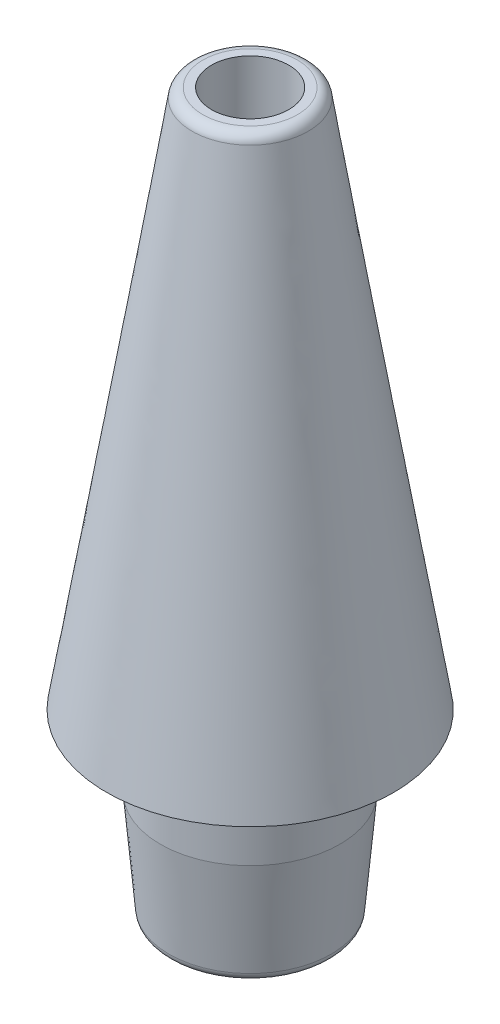
ISO-10303-21;
HEADER;
FILE_DESCRIPTION(('STEP AP214'),'2;1');
FILE_NAME('part.step','',(''),(''),'','','');
FILE_SCHEMA(('AUTOMOTIVE_DESIGN { 1 0 10303 214 1 1 1 1 }'));
ENDSEC;
DATA;
#1=APPLICATION_CONTEXT('core data for automotive mechanical design processes');
#2=APPLICATION_PROTOCOL_DEFINITION('international standard','automotive_design',2000,#1);
#3=PRODUCT_CONTEXT('',#1,'mechanical');
#4=PRODUCT('Part','Part','',(#3));
#5=PRODUCT_RELATED_PRODUCT_CATEGORY('part','',(#4));
#6=PRODUCT_DEFINITION_FORMATION('','',#4);
#7=PRODUCT_DEFINITION_CONTEXT('part definition',#1,'design');
#8=PRODUCT_DEFINITION('design','',#6,#7);
#9=PRODUCT_DEFINITION_SHAPE('','',#8);
#10=(LENGTH_UNIT() NAMED_UNIT(*) SI_UNIT(.MILLI.,.METRE.));
#11=(NAMED_UNIT(*) PLANE_ANGLE_UNIT() SI_UNIT($,.RADIAN.));
#12=(NAMED_UNIT(*) SI_UNIT($,.STERADIAN.) SOLID_ANGLE_UNIT());
#13=UNCERTAINTY_MEASURE_WITH_UNIT(LENGTH_MEASURE(1.E-05),#10,'distance_accuracy_value','');
#14=(GEOMETRIC_REPRESENTATION_CONTEXT(3) GLOBAL_UNCERTAINTY_ASSIGNED_CONTEXT((#13)) GLOBAL_UNIT_ASSIGNED_CONTEXT((#10,
#11,#12)) REPRESENTATION_CONTEXT('',''));
#15=CARTESIAN_POINT('',(0.,0.,0.));
#16=DIRECTION('',(0.,0.,1.));
#17=DIRECTION('',(1.,0.,0.));
#18=AXIS2_PLACEMENT_3D('',#15,#16,#17);
#19=CARTESIAN_POINT('',(0.,5.,0.));
#20=DIRECTION('',(0.,-1.,0.));
#21=DIRECTION('',(0.,0.,-1.));
#22=AXIS2_PLACEMENT_3D('',#19,#20,#21);
#23=CYLINDRICAL_SURFACE('',#22,2.5);
#24=CARTESIAN_POINT('',(0.,4.75,0.));
#25=DIRECTION('',(0.,1.,0.));
#26=DIRECTION('',(0.,0.,1.));
#27=AXIS2_PLACEMENT_3D('',#24,#25,#26);
#28=CIRCLE('',#27,2.5);
#29=CARTESIAN_POINT('',(0.,4.75,2.5));
#30=VERTEX_POINT('',#29);
#31=EDGE_CURVE('E61',#30,#30,#28,.F.);
#32=ORIENTED_EDGE('',*,*,#31,.T.);
#33=EDGE_LOOP('',(#32));
#34=FACE_BOUND('',#33,.T.);
#35=CARTESIAN_POINT('',(0.,2.99999999999999,0.));
#36=DIRECTION('',(0.,1.,0.));
#37=DIRECTION('',(0.,0.,1.));
#38=AXIS2_PLACEMENT_3D('',#35,#36,#37);
#39=CIRCLE('',#38,2.5);
#40=CARTESIAN_POINT('',(0.,2.99999999999999,2.5));
#41=VERTEX_POINT('',#40);
#42=EDGE_CURVE('E73',#41,#41,#39,.T.);
#43=ORIENTED_EDGE('',*,*,#42,.T.);
#44=EDGE_LOOP('',(#43));
#45=FACE_BOUND('',#44,.T.);
#46=ADVANCED_FACE('F39',(#34,#45),#23,.T.);
#47=CARTESIAN_POINT('',(0.,0.,0.));
#48=DIRECTION('',(0.,1.,0.));
#49=DIRECTION('',(0.,0.,1.));
#50=AXIS2_PLACEMENT_3D('',#47,#48,#49);
#51=PLANE('',#50);
#52=CARTESIAN_POINT('',(0.,0.,0.));
#53=DIRECTION('',(0.,1.,0.));
#54=DIRECTION('',(0.,0.,1.));
#55=AXIS2_PLACEMENT_3D('',#52,#53,#54);
#56=CIRCLE('',#55,1.6164221937018);
#57=CARTESIAN_POINT('',(0.,0.,1.6164221937018));
#58=VERTEX_POINT('',#57);
#59=EDGE_CURVE('E52',#58,#58,#56,.T.);
#60=ORIENTED_EDGE('',*,*,#59,.T.);
#61=EDGE_LOOP('',(#60));
#62=FACE_BOUND('',#61,.T.);
#63=CARTESIAN_POINT('',(0.,0.,0.));
#64=DIRECTION('',(0.,1.,0.));
#65=DIRECTION('',(0.,0.,1.));
#66=AXIS2_PLACEMENT_3D('',#63,#64,#65);
#67=CIRCLE('',#66,2.00845121591788);
#68=CARTESIAN_POINT('',(0.,0.,2.00845121591788));
#69=VERTEX_POINT('',#68);
#70=EDGE_CURVE('E56',#69,#69,#67,.F.);
#71=ORIENTED_EDGE('',*,*,#70,.T.);
#72=EDGE_LOOP('',(#71));
#73=FACE_BOUND('',#72,.T.);
#74=ADVANCED_FACE('F100',(#62,#73),#51,.F.);
#75=CARTESIAN_POINT('',(0.,5.,0.));
#76=DIRECTION('',(0.,1.,0.));
#77=DIRECTION('',(0.,0.,1.));
#78=AXIS2_PLACEMENT_3D('',#75,#76,#77);
#79=PLANE('',#78);
#80=CARTESIAN_POINT('',(0.,5.,0.));
#81=DIRECTION('',(0.,1.,0.));
#82=DIRECTION('',(0.,0.,1.));
#83=AXIS2_PLACEMENT_3D('',#80,#81,#82);
#84=CIRCLE('',#83,2.75);
#85=CARTESIAN_POINT('',(0.,5.,2.75));
#86=VERTEX_POINT('',#85);
#87=EDGE_CURVE('E64',#86,#86,#84,.T.);
#88=ORIENTED_EDGE('',*,*,#87,.T.);
#89=EDGE_LOOP('',(#88));
#90=FACE_BOUND('',#89,.T.);
#91=CARTESIAN_POINT('',(0.,5.,0.));
#92=DIRECTION('',(0.,1.,0.));
#93=DIRECTION('',(0.,0.,1.));
#94=AXIS2_PLACEMENT_3D('',#91,#92,#93);
#95=CIRCLE('',#94,4.);
#96=CARTESIAN_POINT('',(-3.8439673327907,5.,-1.10630698471897));
#97=VERTEX_POINT('',#96);
#98=EDGE_CURVE('E79',#97,#97,#95,.T.);
#99=ORIENTED_EDGE('',*,*,#98,.F.);
#100=EDGE_LOOP('',(#99));
#101=FACE_BOUND('',#100,.T.);
#102=ADVANCED_FACE('F91',(#90,#101),#79,.F.);
#103=CARTESIAN_POINT('',(0.,20.,0.));
#104=DIRECTION('',(0.,1.,0.));
#105=DIRECTION('',(0.,0.,1.));
#106=AXIS2_PLACEMENT_3D('',#103,#104,#105);
#107=PLANE('',#106);
#108=CARTESIAN_POINT('',(0.,20.,0.));
#109=DIRECTION('',(0.,1.,0.));
#110=DIRECTION('',(0.,0.,1.));
#111=AXIS2_PLACEMENT_3D('',#108,#109,#110);
#112=CIRCLE('',#111,1.31823689816922);
#113=CARTESIAN_POINT('',(0.,20.,1.31823689816922));
#114=VERTEX_POINT('',#113);
#115=EDGE_CURVE('E70',#114,#114,#112,.T.);
#116=ORIENTED_EDGE('',*,*,#115,.T.);
#117=EDGE_LOOP('',(#116));
#118=FACE_BOUND('',#117,.T.);
#119=CARTESIAN_POINT('',(0.,20.,0.));
#120=DIRECTION('',(0.,1.,0.));
#121=DIRECTION('',(0.,0.,1.));
#122=AXIS2_PLACEMENT_3D('',#119,#120,#121);
#123=CIRCLE('',#122,1.075);
#124=CARTESIAN_POINT('',(0.,20.,1.075));
#125=VERTEX_POINT('',#124);
#126=EDGE_CURVE('E82',#125,#125,#123,.T.);
#127=ORIENTED_EDGE('',*,*,#126,.F.);
#128=EDGE_LOOP('',(#127));
#129=FACE_BOUND('',#128,.T.);
#130=ADVANCED_FACE('F88',(#118,#129),#107,.T.);
#131=CARTESIAN_POINT('',(-1.39239365673616,20.,-0.736114736084607));
#132=CARTESIAN_POINT('',(-3.8439673327907,5.,-1.10630698471897));
#133=CARTESIAN_POINT('',(0.0798358154330552,20.,-3.52090204955692));
#134=CARTESIAN_POINT('',(-1.63135336335275,5.,-8.79424165030036));
#135=CARTESIAN_POINT('',(2.86462312890537,20.,-2.04867257738771));
#136=CARTESIAN_POINT('',(6.05658130222864,5.,-6.58162768086242));
#137=CARTESIAN_POINT('',(1.39239365673616,20.,0.736114736084607));
#138=CARTESIAN_POINT('',(3.8439673327907,5.,1.10630698471897));
#139=CARTESIAN_POINT('',(-0.0798358154330547,20.,3.52090204955692));
#140=CARTESIAN_POINT('',(1.63135336335275,5.,8.79424165030036));
#141=CARTESIAN_POINT('',(-2.86462312890537,20.,2.04867257738771));
#142=CARTESIAN_POINT('',(-6.05658130222864,5.,6.58162768086242));
#143=CARTESIAN_POINT('',(-1.39239365673616,20.,-0.736114736084607));
#144=CARTESIAN_POINT('',(-3.8439673327907,5.,-1.10630698471897));
#145=(BOUNDED_SURFACE() B_SPLINE_SURFACE(3,1,((#131,#132),(#133,#134),(#135,#136),(#137,#138),
(#139,#140),(#141,#142),(#143,#144)),.UNSPECIFIED.,.T.,.F.,.F.) B_SPLINE_SURFACE_WITH_KNOTS((4,
3,4),(2,2),(0.,0.5,1.),(0.,1.),
.UNSPECIFIED.) GEOMETRIC_REPRESENTATION_ITEM() RATIONAL_B_SPLINE_SURFACE(((1.,1.),
(0.333333333333333,0.333333333333333),(0.333333333333333,0.333333333333333),(1.,1.),
(0.333333333333333,0.333333333333333),(0.333333333333333,0.333333333333333),(1.,1.))) REPRESENTATION_ITEM('') SURFACE());
#146=CARTESIAN_POINT('',(0.,19.7463812537881,0.));
#147=DIRECTION('',(0.,-1.,0.));
#148=DIRECTION('',(0.,0.,-1.));
#149=AXIS2_PLACEMENT_3D('',#146,#147,#148);
#150=CIRCLE('',#149,1.61462984561745);
#151=CARTESIAN_POINT('',(-1.43384465953396,19.7463812537881,-0.742373915681675));
#152=VERTEX_POINT('',#151);
#153=EDGE_CURVE('E67',#152,#152,#150,.T.);
#154=CARTESIAN_POINT('',(-1.43384465953396,19.7463812537881,-0.742373915681675));
#155=CARTESIAN_POINT('',(-1.45895010404706,19.5927731157278,-0.746164885150813));
#156=CARTESIAN_POINT('',(-1.48405554856015,19.4391649776675,-0.749955854619952));
#157=CARTESIAN_POINT('',(-1.53426643758633,19.1319487015469,-0.757537793558229));
#158=CARTESIAN_POINT('',(-1.55937188209942,18.9783405634866,-0.761328763027367));
#159=CARTESIAN_POINT('',(-1.6095827711256,18.671124287366,-0.768910701965644));
#160=CARTESIAN_POINT('',(-1.63468821563869,18.5175161493057,-0.772701671434783));
#161=CARTESIAN_POINT('',(-1.68489910466487,18.2102998731852,-0.78028361037306));
#162=CARTESIAN_POINT('',(-1.71000454917796,18.0566917351249,-0.784074579842198));
#163=CARTESIAN_POINT('',(-1.76021543820415,17.7494754590043,-0.791656518780475));
#164=CARTESIAN_POINT('',(-1.78532088271724,17.595867320944,-0.795447488249614));
#165=CARTESIAN_POINT('',(-1.83553177174342,17.2886510448234,-0.803029427187891));
#166=CARTESIAN_POINT('',(-1.86063721625651,17.1350429067631,-0.806820396657029));
#167=CARTESIAN_POINT('',(-1.91084810528269,16.8278266306425,-0.814402335595306));
#168=CARTESIAN_POINT('',(-1.93595354979578,16.6742184925822,-0.818193305064445));
#169=CARTESIAN_POINT('',(-1.98616443882197,16.3670022164616,-0.825775244002722));
#170=CARTESIAN_POINT('',(-2.01126988333506,16.2133940784014,-0.82956621347186));
#171=CARTESIAN_POINT('',(-2.06148077236124,15.9061778022808,-0.837148152410138));
#172=CARTESIAN_POINT('',(-2.08658621687433,15.7525696642205,-0.840939121879276));
#173=CARTESIAN_POINT('',(-2.13679710590051,15.4453533880999,-0.848521060817553));
#174=CARTESIAN_POINT('',(-2.1619025504136,15.2917452500396,-0.852312030286691));
#175=CARTESIAN_POINT('',(-2.21211343943978,14.984528973919,-0.859893969224968));
#176=CARTESIAN_POINT('',(-2.23721888395287,14.8309208358587,-0.863684938694107));
#177=CARTESIAN_POINT('',(-2.28742977297906,14.5237045597381,-0.871266877632384));
#178=CARTESIAN_POINT('',(-2.31253521749215,14.3700964216778,-0.875057847101522));
#179=CARTESIAN_POINT('',(-2.36274610651833,14.0628801455573,-0.8826397860398));
#180=CARTESIAN_POINT('',(-2.38785155103142,13.909272007497,-0.886430755508938));
#181=CARTESIAN_POINT('',(-2.4380624400576,13.6020557313764,-0.894012694447215));
#182=CARTESIAN_POINT('',(-2.46316788457069,13.4484475933161,-0.897803663916354));
#183=CARTESIAN_POINT('',(-2.51337877359688,13.1412313171955,-0.905385602854631));
#184=CARTESIAN_POINT('',(-2.53848421810997,12.9876231791352,-0.909176572323769));
#185=CARTESIAN_POINT('',(-2.58869510713615,12.6804069030146,-0.916758511262046));
#186=CARTESIAN_POINT('',(-2.61380055164924,12.5267987649543,-0.920549480731185));
#187=CARTESIAN_POINT('',(-2.66401144067542,12.2195824888337,-0.928131419669462));
#188=CARTESIAN_POINT('',(-2.68911688518851,12.0659743507735,-0.9319223891386));
#189=CARTESIAN_POINT('',(-2.73932777421469,11.7587580746529,-0.939504328076877));
#190=CARTESIAN_POINT('',(-2.76443321872779,11.6051499365926,-0.943295297546016));
#191=CARTESIAN_POINT('',(-2.81464410775397,11.297933660472,-0.950877236484293));
#192=CARTESIAN_POINT('',(-2.83974955226706,11.1443255224117,-0.954668205953431));
#193=CARTESIAN_POINT('',(-2.88996044129324,10.8371092462911,-0.962250144891708));
#194=CARTESIAN_POINT('',(-2.91506588580633,10.6835011082308,-0.966041114360847));
#195=CARTESIAN_POINT('',(-2.96527677483251,10.3762848321102,-0.973623053299124));
#196=CARTESIAN_POINT('',(-2.9903822193456,10.2226766940499,-0.977414022768262));
#197=CARTESIAN_POINT('',(-3.04059310837179,9.91546041792936,-0.984995961706539));
#198=CARTESIAN_POINT('',(-3.06569855288488,9.76185227986907,-0.988786931175678));
#199=CARTESIAN_POINT('',(-3.11590944191106,9.45463600374848,-0.996368870113955));
#200=CARTESIAN_POINT('',(-3.14101488642415,9.30102786568819,-1.00015983958309));
#201=CARTESIAN_POINT('',(-3.19122577545033,8.99381158956761,-1.00774177852137));
#202=CARTESIAN_POINT('',(-3.21633121996342,8.84020345150732,-1.01153274799051));
#203=CARTESIAN_POINT('',(-3.2665421089896,8.53298717538673,-1.01911468692879));
#204=CARTESIAN_POINT('',(-3.2916475535027,8.37937903732644,-1.02290565639792));
#205=CARTESIAN_POINT('',(-3.34185844252888,8.07216276120585,-1.0304875953362));
#206=CARTESIAN_POINT('',(-3.36696388704197,7.91855462314556,-1.03427856480534));
#207=CARTESIAN_POINT('',(-3.41717477606815,7.61133834702497,-1.04186050374362));
#208=CARTESIAN_POINT('',(-3.44228022058124,7.45773020896468,-1.04565147321276));
#209=CARTESIAN_POINT('',(-3.49249110960742,7.15051393284409,-1.05323341215103));
#210=CARTESIAN_POINT('',(-3.51759655412051,6.9969057947838,-1.05702438162017));
#211=CARTESIAN_POINT('',(-3.5678074431467,6.68968951866322,-1.06460632055845));
#212=CARTESIAN_POINT('',(-3.59291288765979,6.53608138060293,-1.06839729002759));
#213=CARTESIAN_POINT('',(-3.64312377668597,6.22886510448234,-1.07597922896586));
#214=CARTESIAN_POINT('',(-3.66822922119906,6.07525696642205,-1.079770198435));
#215=CARTESIAN_POINT('',(-3.71844011022524,5.76804069030146,-1.08735213737328));
#216=CARTESIAN_POINT('',(-3.74354555473833,5.61443255224117,-1.09114310684242));
#217=CARTESIAN_POINT('',(-3.79375644376451,5.30721627612059,-1.09872504578069));
#218=CARTESIAN_POINT('',(-3.8188618882776,5.15360813806029,-1.10251601524983));
#219=CARTESIAN_POINT('',(-3.8439673327907,5.,-1.10630698471897));
#220=B_SPLINE_CURVE_WITH_KNOTS('',3,(#154,#155,#156,#157,#158,#159,#160,#161,#162,#163,#164,
#165,#166,#167,#168,#169,#170,#171,#172,#173,#174,#175,#176,#177,#178,#179,#180,#181,#182,#183,
#184,#185,#186,#187,#188,#189,#190,#191,#192,#193,#194,#195,#196,#197,#198,#199,#200,#201,#202,
#203,#204,#205,#206,#207,#208,#209,#210,#211,#212,#213,#214,#215,#216,#217,#218,#219),
.UNSPECIFIED.,.F.,.F.,(4,2,2,2,2,2,2,2,2,2,2,2,2,2,2,2,2,2,2,2,2,2,2,2,2,2,2,2,2,2,2,2,4),(0.,
0.467077117667511,0.934154235335025,1.40123135300254,1.86830847067005,2.33538558833756,
2.80246270600508,3.26953982367259,3.7366169413401,4.20369405900761,4.67077117667513,
5.13784829434264,5.60492541201015,6.07200252967766,6.53907964734518,7.00615676501269,
7.4732338826802,7.94031100034772,8.40738811801523,8.87446523568274,9.34154235335025,
9.80861947101777,10.2756965886853,10.7427737063528,11.2098508240203,11.6769279416878,
12.1440050593553,12.6110821770228,13.0781592946904,13.5452364123579,14.0123135300254,
14.4793906476929,14.9464677653604),.UNSPECIFIED.);
#221=EDGE_CURVE('BSEAM90',#152,#97,#220,.T.);
#222=ORIENTED_EDGE('',*,*,#153,.T.);
#223=ORIENTED_EDGE('',*,*,#98,.T.);
#224=ORIENTED_EDGE('',*,*,#221,.T.);
#225=ORIENTED_EDGE('',*,*,#221,.F.);
#226=EDGE_LOOP('',(#222,#224,#223,#225));
#227=FACE_BOUND('',#226,.T.);
#228=ADVANCED_FACE('F90',(#227),#145,.T.);
#229=CARTESIAN_POINT('',(0.,0.,0.));
#230=DIRECTION('',(0.,1.,0.));
#231=DIRECTION('',(0.,0.,1.));
#232=AXIS2_PLACEMENT_3D('',#229,#230,#231);
#233=CYLINDRICAL_SURFACE('',#232,1.075);
#234=CARTESIAN_POINT('',(0.,8.59087598487545,0.));
#235=DIRECTION('',(0.,1.,0.));
#236=DIRECTION('',(0.,0.,1.));
#237=AXIS2_PLACEMENT_3D('',#234,#235,#236);
#238=CIRCLE('',#237,1.075);
#239=CARTESIAN_POINT('',(0.,8.59087598487545,-1.075));
#240=VERTEX_POINT('',#239);
#241=EDGE_CURVE('E76',#240,#240,#238,.F.);
#242=ORIENTED_EDGE('',*,*,#241,.T.);
#243=EDGE_LOOP('',(#242));
#244=FACE_BOUND('',#243,.T.);
#245=ORIENTED_EDGE('',*,*,#126,.T.);
#246=EDGE_LOOP('',(#245));
#247=FACE_BOUND('',#246,.T.);
#248=ADVANCED_FACE('F86',(#244,#247),#233,.F.);
#249=CARTESIAN_POINT('',(0.,0.,0.));
#250=DIRECTION('',(0.,-1.,0.));
#251=DIRECTION('',(0.,0.,-1.));
#252=AXIS2_PLACEMENT_3D('',#249,#250,#251);
#253=CONICAL_SURFACE('',#252,1.37500000000003,0.0349065850398873);
#254=CARTESIAN_POINT('',(0.,0.241275125824375,0.));
#255=DIRECTION('',(0.,-1.,0.));
#256=DIRECTION('',(0.,0.,-1.));
#257=AXIS2_PLACEMENT_3D('',#254,#255,#256);
#258=CIRCLE('',#257,1.36657448694703);
#259=CARTESIAN_POINT('',(0.,0.241275125824375,-1.36657448694703));
#260=VERTEX_POINT('',#259);
#261=EDGE_CURVE('E47',#260,#260,#258,.T.);
#262=CARTESIAN_POINT('',(0.,0.241275125824375,-1.36657448694703));
#263=CARTESIAN_POINT('',(0.,0.328250134772823,-1.363537252708));
#264=CARTESIAN_POINT('',(0.,0.415225143721272,-1.36050001846896));
#265=CARTESIAN_POINT('',(0.,0.589175161618169,-1.3544255499909));
#266=CARTESIAN_POINT('',(0.,0.676150170566618,-1.35138831575187));
#267=CARTESIAN_POINT('',(0.,0.850100188463516,-1.34531384727381));
#268=CARTESIAN_POINT('',(0.,0.937075197411964,-1.34227661303477));
#269=CARTESIAN_POINT('',(0.,1.11102521530886,-1.33620214455671));
#270=CARTESIAN_POINT('',(0.,1.19800022425731,-1.33316491031768));
#271=CARTESIAN_POINT('',(0.,1.37195024215421,-1.32709044183962));
#272=CARTESIAN_POINT('',(0.,1.45892525110266,-1.32405320760059));
#273=CARTESIAN_POINT('',(0.,1.63287526899955,-1.31797873912252));
#274=CARTESIAN_POINT('',(0.,1.719850277948,-1.31494150488349));
#275=CARTESIAN_POINT('',(0.,1.8938002958449,-1.30886703640543));
#276=CARTESIAN_POINT('',(0.,1.98077530479335,-1.3058298021664));
#277=CARTESIAN_POINT('',(0.,2.15472532269025,-1.29975533368833));
#278=CARTESIAN_POINT('',(0.,2.2417003316387,-1.2967180994493));
#279=CARTESIAN_POINT('',(0.,2.41565034953559,-1.29064363097124));
#280=CARTESIAN_POINT('',(0.,2.50262535848404,-1.28760639673221));
#281=CARTESIAN_POINT('',(0.,2.67657537638094,-1.28153192825414));
#282=CARTESIAN_POINT('',(0.,2.76355038532939,-1.27849469401511));
#283=CARTESIAN_POINT('',(0.,2.93750040322629,-1.27242022553705));
#284=CARTESIAN_POINT('',(0.,3.02447541217473,-1.26938299129802));
#285=CARTESIAN_POINT('',(0.,3.19842543007163,-1.26330852281995));
#286=CARTESIAN_POINT('',(0.,3.28540043902008,-1.26027128858092));
#287=CARTESIAN_POINT('',(0.,3.45935045691698,-1.25419682010286));
#288=CARTESIAN_POINT('',(0.,3.54632546586543,-1.25115958586383));
#289=CARTESIAN_POINT('',(0.,3.72027548376232,-1.24508511738577));
#290=CARTESIAN_POINT('',(0.,3.80725049271077,-1.24204788314673));
#291=CARTESIAN_POINT('',(0.,3.98120051060767,-1.23597341466867));
#292=CARTESIAN_POINT('',(0.,4.06817551955612,-1.23293618042964));
#293=CARTESIAN_POINT('',(0.,4.24212553745302,-1.22686171195158));
#294=CARTESIAN_POINT('',(0.,4.32910054640146,-1.22382447771255));
#295=CARTESIAN_POINT('',(0.,4.50305056429836,-1.21775000923448));
#296=CARTESIAN_POINT('',(0.,4.59002557324681,-1.21471277499545));
#297=CARTESIAN_POINT('',(0.,4.76397559114371,-1.20863830651739));
#298=CARTESIAN_POINT('',(0.,4.85095060009216,-1.20560107227836));
#299=CARTESIAN_POINT('',(0.,5.02490061798905,-1.19952660380029));
#300=CARTESIAN_POINT('',(0.,5.1118756269375,-1.19648936956126));
#301=CARTESIAN_POINT('',(0.,5.2858256448344,-1.1904149010832));
#302=CARTESIAN_POINT('',(0.,5.37280065378285,-1.18737766684417));
#303=CARTESIAN_POINT('',(0.,5.54675067167975,-1.1813031983661));
#304=CARTESIAN_POINT('',(0.,5.6337256806282,-1.17826596412707));
#305=CARTESIAN_POINT('',(0.,5.80767569852509,-1.17219149564901));
#306=CARTESIAN_POINT('',(0.,5.89465070747354,-1.16915426140998));
#307=CARTESIAN_POINT('',(0.,6.06860072537044,-1.16307979293191));
#308=CARTESIAN_POINT('',(0.,6.15557573431889,-1.16004255869288));
#309=CARTESIAN_POINT('',(0.,6.32952575221579,-1.15396809021482));
#310=CARTESIAN_POINT('',(0.,6.41650076116423,-1.15093085597579));
#311=CARTESIAN_POINT('',(0.,6.59045077906113,-1.14485638749773));
#312=CARTESIAN_POINT('',(0.,6.67742578800958,-1.14181915325869));
#313=CARTESIAN_POINT('',(0.,6.85137580590648,-1.13574468478063));
#314=CARTESIAN_POINT('',(0.,6.93835081485493,-1.1327074505416));
#315=CARTESIAN_POINT('',(0.,7.11230083275182,-1.12663298206354));
#316=CARTESIAN_POINT('',(0.,7.19927584170027,-1.1235957478245));
#317=CARTESIAN_POINT('',(0.,7.37322585959717,-1.11752127934644));
#318=CARTESIAN_POINT('',(0.,7.46020086854562,-1.11448404510741));
#319=CARTESIAN_POINT('',(0.,7.63415088644252,-1.10840957662935));
#320=CARTESIAN_POINT('',(0.,7.72112589539096,-1.10537234239032));
#321=CARTESIAN_POINT('',(0.,7.89507591328786,-1.09929787391225));
#322=CARTESIAN_POINT('',(0.,7.98205092223631,-1.09626063967322));
#323=CARTESIAN_POINT('',(0.,8.15600094013321,-1.09018617119516));
#324=CARTESIAN_POINT('',(0.,8.24297594908166,-1.08714893695613));
#325=CARTESIAN_POINT('',(0.,8.41692596697855,-1.08107446847806));
#326=CARTESIAN_POINT('',(0.,8.503900975927,-1.07803723423903));
#327=CARTESIAN_POINT('',(0.,8.59087598487545,-1.075));
#328=B_SPLINE_CURVE_WITH_KNOTS('',3,(#262,#263,#264,#265,#266,#267,#268,#269,#270,#271,#272,
#273,#274,#275,#276,#277,#278,#279,#280,#281,#282,#283,#284,#285,#286,#287,#288,#289,#290,#291,
#292,#293,#294,#295,#296,#297,#298,#299,#300,#301,#302,#303,#304,#305,#306,#307,#308,#309,#310,
#311,#312,#313,#314,#315,#316,#317,#318,#319,#320,#321,#322,#323,#324,#325,#326,#327),
.UNSPECIFIED.,.F.,.F.,(4,2,2,2,2,2,2,2,2,2,2,2,2,2,2,2,2,2,2,2,2,2,2,2,2,2,2,2,2,2,2,2,4),(0.,
0.26108407220788,0.522168144415759,0.783252216623639,1.04433628883152,1.3054203610394,
1.56650443324728,1.82758850545516,2.08867257766304,2.34975664987092,2.6108407220788,
2.87192479428668,3.13300886649456,3.39409293870244,3.65517701091032,3.9162610831182,
4.17734515532608,4.43842922753396,4.69951329974184,4.96059737194972,5.2216814441576,
5.48276551636547,5.74384958857335,6.00493366078123,6.26601773298911,6.52710180519699,
6.78818587740487,7.04926994961275,7.31035402182063,7.57143809402851,7.83252216623639,
8.09360623844427,8.35469031065215),.UNSPECIFIED.);
#329=EDGE_CURVE('BSEAM114',#260,#240,#328,.T.);
#330=ORIENTED_EDGE('',*,*,#261,.T.);
#331=ORIENTED_EDGE('',*,*,#241,.F.);
#332=ORIENTED_EDGE('',*,*,#329,.T.);
#333=ORIENTED_EDGE('',*,*,#329,.F.);
#334=EDGE_LOOP('',(#330,#332,#331,#333));
#335=FACE_BOUND('',#334,.T.);
#336=ADVANCED_FACE('F114',(#335),#253,.F.);
#337=CARTESIAN_POINT('',(0.,2.99999999999999,0.));
#338=DIRECTION('',(0.,1.,0.));
#339=DIRECTION('',(0.,0.,1.));
#340=AXIS2_PLACEMENT_3D('',#337,#338,#339);
#341=CONICAL_SURFACE('',#340,2.5,0.0872664625997141);
#342=CARTESIAN_POINT('',(0.,0.228211064313086,0.));
#343=DIRECTION('',(0.,1.,0.));
#344=DIRECTION('',(0.,0.,1.));
#345=AXIS2_PLACEMENT_3D('',#342,#343,#344);
#346=CIRCLE('',#345,2.25749989044082);
#347=CARTESIAN_POINT('',(0.,0.228211064313086,2.25749989044082));
#348=VERTEX_POINT('',#347);
#349=EDGE_CURVE('E11',#348,#348,#346,.T.);
#350=ORIENTED_EDGE('',*,*,#349,.T.);
#351=EDGE_LOOP('',(#350));
#352=FACE_BOUND('',#351,.T.);
#353=ORIENTED_EDGE('',*,*,#42,.F.);
#354=EDGE_LOOP('',(#353));
#355=FACE_BOUND('',#354,.T.);
#356=ADVANCED_FACE('F117',(#352,#355),#341,.T.);
#357=CARTESIAN_POINT('',(0.,19.7,0.));
#358=DIRECTION('',(0.,-1.,0.));
#359=DIRECTION('',(0.,0.,-1.));
#360=AXIS2_PLACEMENT_3D('',#357,#358,#359);
#361=TOROIDAL_SURFACE('',#360,1.31823689816922,0.3);
#362=ORIENTED_EDGE('',*,*,#153,.F.);
#363=EDGE_LOOP('',(#362));
#364=FACE_BOUND('',#363,.T.);
#365=ORIENTED_EDGE('',*,*,#115,.F.);
#366=EDGE_LOOP('',(#365));
#367=FACE_BOUND('',#366,.T.);
#368=ADVANCED_FACE('F120',(#364,#367),#361,.T.);
#369=CARTESIAN_POINT('',(0.,4.75,0.));
#370=DIRECTION('',(0.,1.,0.));
#371=DIRECTION('',(0.,0.,1.));
#372=AXIS2_PLACEMENT_3D('',#369,#370,#371);
#373=TOROIDAL_SURFACE('',#372,2.75,0.25);
#374=ORIENTED_EDGE('',*,*,#31,.F.);
#375=EDGE_LOOP('',(#374));
#376=FACE_BOUND('',#375,.T.);
#377=ORIENTED_EDGE('',*,*,#87,.F.);
#378=EDGE_LOOP('',(#377));
#379=FACE_BOUND('',#378,.T.);
#380=ADVANCED_FACE('F123',(#376,#379),#373,.F.);
#381=CARTESIAN_POINT('',(0.,0.25,0.));
#382=DIRECTION('',(0.,1.,0.));
#383=DIRECTION('',(0.,0.,1.));
#384=AXIS2_PLACEMENT_3D('',#381,#382,#383);
#385=TOROIDAL_SURFACE('',#384,1.6164221937018,0.25);
#386=ORIENTED_EDGE('',*,*,#261,.F.);
#387=EDGE_LOOP('',(#386));
#388=FACE_BOUND('',#387,.T.);
#389=ORIENTED_EDGE('',*,*,#59,.F.);
#390=EDGE_LOOP('',(#389));
#391=FACE_BOUND('',#390,.T.);
#392=ADVANCED_FACE('F126',(#388,#391),#385,.T.);
#393=CARTESIAN_POINT('',(0.,0.25,0.));
#394=DIRECTION('',(0.,1.,0.));
#395=DIRECTION('',(0.,0.,1.));
#396=AXIS2_PLACEMENT_3D('',#393,#394,#395);
#397=TOROIDAL_SURFACE('',#396,2.00845121591788,0.25);
#398=ORIENTED_EDGE('',*,*,#349,.F.);
#399=EDGE_LOOP('',(#398));
#400=FACE_BOUND('',#399,.T.);
#401=ORIENTED_EDGE('',*,*,#70,.F.);
#402=EDGE_LOOP('',(#401));
#403=FACE_BOUND('',#402,.T.);
#404=ADVANCED_FACE('F41',(#400,#403),#397,.T.);
#405=CLOSED_SHELL('',(#46,#74,#102,#130,#228,#248,#336,#356,#368,#380,#392,#404));
#406=MANIFOLD_SOLID_BREP('B2',#405);
#407=ADVANCED_BREP_SHAPE_REPRESENTATION('',(#18,#406),#14);
#408=SHAPE_DEFINITION_REPRESENTATION(#9,#407);
ENDSEC;
END-ISO-10303-21;
